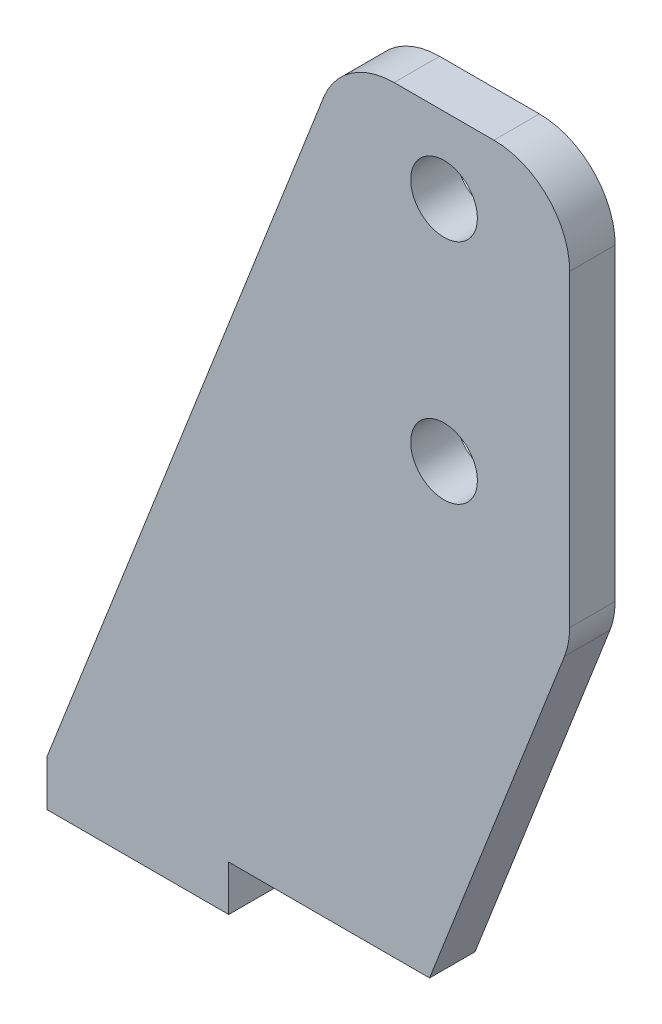
ISO-10303-21;
HEADER;
FILE_DESCRIPTION(('STEP AP214'),'2;1');
FILE_NAME('part.step','',(''),(''),'','','');
FILE_SCHEMA(('AUTOMOTIVE_DESIGN { 1 0 10303 214 1 1 1 1 }'));
ENDSEC;
DATA;
#1=APPLICATION_CONTEXT('core data for automotive mechanical design processes');
#2=APPLICATION_PROTOCOL_DEFINITION('international standard','automotive_design',2000,#1);
#3=PRODUCT_CONTEXT('',#1,'mechanical');
#4=PRODUCT('Part','Part','',(#3));
#5=PRODUCT_RELATED_PRODUCT_CATEGORY('part','',(#4));
#6=PRODUCT_DEFINITION_FORMATION('','',#4);
#7=PRODUCT_DEFINITION_CONTEXT('part definition',#1,'design');
#8=PRODUCT_DEFINITION('design','',#6,#7);
#9=PRODUCT_DEFINITION_SHAPE('','',#8);
#10=(LENGTH_UNIT() NAMED_UNIT(*) SI_UNIT(.MILLI.,.METRE.));
#11=(NAMED_UNIT(*) PLANE_ANGLE_UNIT() SI_UNIT($,.RADIAN.));
#12=(NAMED_UNIT(*) SI_UNIT($,.STERADIAN.) SOLID_ANGLE_UNIT());
#13=UNCERTAINTY_MEASURE_WITH_UNIT(LENGTH_MEASURE(1.E-05),#10,'distance_accuracy_value','');
#14=(GEOMETRIC_REPRESENTATION_CONTEXT(3) GLOBAL_UNCERTAINTY_ASSIGNED_CONTEXT((#13)) GLOBAL_UNIT_ASSIGNED_CONTEXT((#10,
#11,#12)) REPRESENTATION_CONTEXT('',''));
#15=CARTESIAN_POINT('',(0.,0.,0.));
#16=DIRECTION('',(0.,0.,1.));
#17=DIRECTION('',(1.,0.,0.));
#18=AXIS2_PLACEMENT_3D('',#15,#16,#17);
#19=CARTESIAN_POINT('',(0.,50.,3.));
#20=DIRECTION('',(0.,1.,0.));
#21=DIRECTION('',(-1.,0.,0.));
#22=AXIS2_PLACEMENT_3D('',#19,#20,#21);
#23=PLANE('',#22);
#24=DIRECTION('',(1.,0.,0.));
#25=VECTOR('',#24,1.);
#26=CARTESIAN_POINT('',(0.,50.,0.));
#27=LINE('',#26,#25);
#28=CARTESIAN_POINT('',(22.9167960646926,50.,0.));
#29=VERTEX_POINT('',#28);
#30=CARTESIAN_POINT('',(29.5,50.,0.));
#31=VERTEX_POINT('',#30);
#32=EDGE_CURVE('E154',#29,#31,#27,.T.);
#33=ORIENTED_EDGE('',*,*,#32,.F.);
#34=DIRECTION('',(0.,0.,-1.));
#35=VECTOR('',#34,1.);
#36=CARTESIAN_POINT('',(22.9167960646926,50.,3.));
#37=LINE('',#36,#35);
#38=CARTESIAN_POINT('',(22.9167960646926,50.,3.));
#39=VERTEX_POINT('',#38);
#40=EDGE_CURVE('E11',#39,#29,#37,.T.);
#41=ORIENTED_EDGE('',*,*,#40,.F.);
#42=DIRECTION('',(1.,0.,0.));
#43=VECTOR('',#42,1.);
#44=CARTESIAN_POINT('',(0.,50.,3.));
#45=LINE('',#44,#43);
#46=CARTESIAN_POINT('',(29.5,50.,3.));
#47=VERTEX_POINT('',#46);
#48=EDGE_CURVE('E222',#39,#47,#45,.T.);
#49=ORIENTED_EDGE('',*,*,#48,.T.);
#50=DIRECTION('',(0.,0.,-1.));
#51=VECTOR('',#50,1.);
#52=CARTESIAN_POINT('',(29.5,50.,3.));
#53=LINE('',#52,#51);
#54=EDGE_CURVE('E95',#47,#31,#53,.T.);
#55=ORIENTED_EDGE('',*,*,#54,.T.);
#56=EDGE_LOOP('',(#33,#41,#49,#55));
#57=FACE_BOUND('',#56,.T.);
#58=ADVANCED_FACE('F35',(#57),#23,.T.);
#59=CARTESIAN_POINT('',(22.9167960646926,45.,3.));
#60=DIRECTION('',(0.,0.,-1.));
#61=DIRECTION('',(-1.,0.,0.));
#62=AXIS2_PLACEMENT_3D('',#59,#60,#61);
#63=CYLINDRICAL_SURFACE('',#62,5.);
#64=CARTESIAN_POINT('',(22.9167960646926,45.,0.));
#65=DIRECTION('',(0.,0.,1.));
#66=DIRECTION('',(1.,0.,0.));
#67=AXIS2_PLACEMENT_3D('',#64,#65,#66);
#68=CIRCLE('',#67,5.);
#69=CARTESIAN_POINT('',(18.2585232891587,46.8167263824582,0.));
#70=VERTEX_POINT('',#69);
#71=EDGE_CURVE('E157',#29,#70,#68,.T.);
#72=ORIENTED_EDGE('',*,*,#71,.T.);
#73=DIRECTION('',(0.,0.,-1.));
#74=VECTOR('',#73,1.);
#75=CARTESIAN_POINT('',(18.2585232891587,46.8167263824582,3.));
#76=LINE('',#75,#74);
#77=CARTESIAN_POINT('',(18.2585232891587,46.8167263824582,3.));
#78=VERTEX_POINT('',#77);
#79=EDGE_CURVE('E44',#78,#70,#76,.T.);
#80=ORIENTED_EDGE('',*,*,#79,.F.);
#81=CARTESIAN_POINT('',(22.9167960646926,45.,3.));
#82=DIRECTION('',(0.,0.,1.));
#83=DIRECTION('',(1.,0.,0.));
#84=AXIS2_PLACEMENT_3D('',#81,#82,#83);
#85=CIRCLE('',#84,5.);
#86=EDGE_CURVE('E220',#39,#78,#85,.T.);
#87=ORIENTED_EDGE('',*,*,#86,.F.);
#88=ORIENTED_EDGE('',*,*,#40,.T.);
#89=EDGE_LOOP('',(#72,#80,#87,#88));
#90=FACE_BOUND('',#89,.T.);
#91=ADVANCED_FACE('F207',(#90),#63,.T.);
#92=CARTESIAN_POINT('',(0.,0.,3.));
#93=DIRECTION('',(-0.931654555106779,0.363345276491644,0.));
#94=DIRECTION('',(-0.363345276491644,-0.93165455510678,0.));
#95=AXIS2_PLACEMENT_3D('',#92,#93,#94);
#96=PLANE('',#95);
#97=DIRECTION('',(0.363345276491644,0.931654555106779,0.));
#98=VECTOR('',#97,1.);
#99=CARTESIAN_POINT('',(0.,0.,0.));
#100=LINE('',#99,#98);
#101=CARTESIAN_POINT('',(0.,0.,0.));
#102=VERTEX_POINT('',#101);
#103=EDGE_CURVE('E160',#102,#70,#100,.T.);
#104=ORIENTED_EDGE('',*,*,#103,.F.);
#105=DIRECTION('',(0.,0.,-1.));
#106=VECTOR('',#105,1.);
#107=CARTESIAN_POINT('',(0.,0.,3.));
#108=LINE('',#107,#106);
#109=CARTESIAN_POINT('',(0.,0.,3.));
#110=VERTEX_POINT('',#109);
#111=EDGE_CURVE('E197',#110,#102,#108,.T.);
#112=ORIENTED_EDGE('',*,*,#111,.F.);
#113=DIRECTION('',(0.363345276491644,0.931654555106779,0.));
#114=VECTOR('',#113,1.);
#115=CARTESIAN_POINT('',(0.,0.,3.));
#116=LINE('',#115,#114);
#117=EDGE_CURVE('E204',#110,#78,#116,.T.);
#118=ORIENTED_EDGE('',*,*,#117,.T.);
#119=ORIENTED_EDGE('',*,*,#79,.T.);
#120=EDGE_LOOP('',(#104,#112,#118,#119));
#121=FACE_BOUND('',#120,.T.);
#122=ADVANCED_FACE('F202',(#121),#96,.T.);
#123=CARTESIAN_POINT('',(0.,0.,3.));
#124=DIRECTION('',(1.,0.,0.));
#125=DIRECTION('',(0.,1.,0.));
#126=AXIS2_PLACEMENT_3D('',#123,#124,#125);
#127=PLANE('',#126);
#128=DIRECTION('',(0.,-1.,0.));
#129=VECTOR('',#128,1.);
#130=CARTESIAN_POINT('',(0.,0.,0.));
#131=LINE('',#130,#129);
#132=CARTESIAN_POINT('',(0.,-3.,0.));
#133=VERTEX_POINT('',#132);
#134=EDGE_CURVE('E163',#102,#133,#131,.T.);
#135=ORIENTED_EDGE('',*,*,#134,.T.);
#136=DIRECTION('',(0.,0.,-1.));
#137=VECTOR('',#136,1.);
#138=CARTESIAN_POINT('',(0.,-3.,3.));
#139=LINE('',#138,#137);
#140=CARTESIAN_POINT('',(0.,-3.,3.));
#141=VERTEX_POINT('',#140);
#142=EDGE_CURVE('E194',#141,#133,#139,.T.);
#143=ORIENTED_EDGE('',*,*,#142,.F.);
#144=DIRECTION('',(0.,-1.,0.));
#145=VECTOR('',#144,1.);
#146=CARTESIAN_POINT('',(0.,0.,3.));
#147=LINE('',#146,#145);
#148=EDGE_CURVE('E216',#110,#141,#147,.T.);
#149=ORIENTED_EDGE('',*,*,#148,.F.);
#150=ORIENTED_EDGE('',*,*,#111,.T.);
#151=EDGE_LOOP('',(#135,#143,#149,#150));
#152=FACE_BOUND('',#151,.T.);
#153=ADVANCED_FACE('F213',(#152),#127,.F.);
#154=CARTESIAN_POINT('',(0.,-3.,3.));
#155=DIRECTION('',(0.,1.,0.));
#156=DIRECTION('',(-1.,0.,0.));
#157=AXIS2_PLACEMENT_3D('',#154,#155,#156);
#158=PLANE('',#157);
#159=DIRECTION('',(1.,0.,0.));
#160=VECTOR('',#159,1.);
#161=CARTESIAN_POINT('',(0.,-3.,0.));
#162=LINE('',#161,#160);
#163=CARTESIAN_POINT('',(12.,-2.99999999999999,0.));
#164=VERTEX_POINT('',#163);
#165=EDGE_CURVE('E166',#133,#164,#162,.T.);
#166=ORIENTED_EDGE('',*,*,#165,.T.);
#167=DIRECTION('',(0.,0.,-1.));
#168=VECTOR('',#167,1.);
#169=CARTESIAN_POINT('',(12.,-2.99999999999999,3.));
#170=LINE('',#169,#168);
#171=CARTESIAN_POINT('',(12.,-2.99999999999999,3.));
#172=VERTEX_POINT('',#171);
#173=EDGE_CURVE('E191',#172,#164,#170,.T.);
#174=ORIENTED_EDGE('',*,*,#173,.F.);
#175=DIRECTION('',(1.,0.,0.));
#176=VECTOR('',#175,1.);
#177=CARTESIAN_POINT('',(0.,-3.,3.));
#178=LINE('',#177,#176);
#179=EDGE_CURVE('E218',#141,#172,#178,.T.);
#180=ORIENTED_EDGE('',*,*,#179,.F.);
#181=ORIENTED_EDGE('',*,*,#142,.T.);
#182=EDGE_LOOP('',(#166,#174,#180,#181));
#183=FACE_BOUND('',#182,.T.);
#184=ADVANCED_FACE('F272',(#183),#158,.F.);
#185=CARTESIAN_POINT('',(12.,0.,3.));
#186=DIRECTION('',(-1.,0.,0.));
#187=DIRECTION('',(0.,0.,1.));
#188=AXIS2_PLACEMENT_3D('',#185,#186,#187);
#189=PLANE('',#188);
#190=DIRECTION('',(0.,1.,0.));
#191=VECTOR('',#190,1.);
#192=CARTESIAN_POINT('',(12.,0.,0.));
#193=LINE('',#192,#191);
#194=CARTESIAN_POINT('',(12.,0.,0.));
#195=VERTEX_POINT('',#194);
#196=EDGE_CURVE('E169',#164,#195,#193,.T.);
#197=ORIENTED_EDGE('',*,*,#196,.T.);
#198=DIRECTION('',(0.,0.,-1.));
#199=VECTOR('',#198,1.);
#200=CARTESIAN_POINT('',(12.,0.,3.));
#201=LINE('',#200,#199);
#202=CARTESIAN_POINT('',(12.,0.,3.));
#203=VERTEX_POINT('',#202);
#204=EDGE_CURVE('E189',#203,#195,#201,.T.);
#205=ORIENTED_EDGE('',*,*,#204,.F.);
#206=DIRECTION('',(0.,1.,0.));
#207=VECTOR('',#206,1.);
#208=CARTESIAN_POINT('',(12.,0.,3.));
#209=LINE('',#208,#207);
#210=EDGE_CURVE('E227',#172,#203,#209,.T.);
#211=ORIENTED_EDGE('',*,*,#210,.F.);
#212=ORIENTED_EDGE('',*,*,#173,.T.);
#213=EDGE_LOOP('',(#197,#205,#211,#212));
#214=FACE_BOUND('',#213,.T.);
#215=ADVANCED_FACE('F275',(#214),#189,.F.);
#216=CARTESIAN_POINT('',(0.,0.,3.));
#217=DIRECTION('',(0.,-1.,0.));
#218=DIRECTION('',(1.,0.,0.));
#219=AXIS2_PLACEMENT_3D('',#216,#217,#218);
#220=PLANE('',#219);
#221=DIRECTION('',(-1.,0.,0.));
#222=VECTOR('',#221,1.);
#223=CARTESIAN_POINT('',(0.,0.,0.));
#224=LINE('',#223,#222);
#225=CARTESIAN_POINT('',(25.2541846633556,0.,0.));
#226=VERTEX_POINT('',#225);
#227=EDGE_CURVE('E172',#226,#195,#224,.T.);
#228=ORIENTED_EDGE('',*,*,#227,.F.);
#229=DIRECTION('',(0.,0.,-1.));
#230=VECTOR('',#229,1.);
#231=CARTESIAN_POINT('',(25.2541846633556,0.,3.));
#232=LINE('',#231,#230);
#233=CARTESIAN_POINT('',(25.2541846633556,0.,3.));
#234=VERTEX_POINT('',#233);
#235=EDGE_CURVE('E187',#234,#226,#232,.T.);
#236=ORIENTED_EDGE('',*,*,#235,.F.);
#237=DIRECTION('',(-1.,0.,0.));
#238=VECTOR('',#237,1.);
#239=CARTESIAN_POINT('',(0.,0.,3.));
#240=LINE('',#239,#238);
#241=EDGE_CURVE('E229',#234,#203,#240,.T.);
#242=ORIENTED_EDGE('',*,*,#241,.T.);
#243=ORIENTED_EDGE('',*,*,#204,.T.);
#244=EDGE_LOOP('',(#228,#236,#242,#243));
#245=FACE_BOUND('',#244,.T.);
#246=ADVANCED_FACE('F279',(#245),#220,.T.);
#247=CARTESIAN_POINT('',(21.9201325087715,-8.54885167842087,3.));
#248=DIRECTION('',(0.931654555106779,-0.363345276491644,0.));
#249=DIRECTION('',(0.363345276491644,0.93165455510678,0.));
#250=AXIS2_PLACEMENT_3D('',#247,#248,#249);
#251=PLANE('',#250);
#252=DIRECTION('',(-0.363345276491644,-0.93165455510678,0.));
#253=VECTOR('',#252,1.);
#254=CARTESIAN_POINT('',(21.9201325087715,-8.54885167842087,0.));
#255=LINE('',#254,#253);
#256=CARTESIAN_POINT('',(34.1582727755339,22.8309951594315,0.));
#257=VERTEX_POINT('',#256);
#258=EDGE_CURVE('E175',#257,#226,#255,.T.);
#259=ORIENTED_EDGE('',*,*,#258,.F.);
#260=DIRECTION('',(0.,0.,-1.));
#261=VECTOR('',#260,1.);
#262=CARTESIAN_POINT('',(34.1582727755339,22.8309951594315,3.));
#263=LINE('',#262,#261);
#264=CARTESIAN_POINT('',(34.1582727755339,22.8309951594315,3.));
#265=VERTEX_POINT('',#264);
#266=EDGE_CURVE('E141',#265,#257,#263,.T.);
#267=ORIENTED_EDGE('',*,*,#266,.F.);
#268=DIRECTION('',(-0.363345276491644,-0.93165455510678,0.));
#269=VECTOR('',#268,1.);
#270=CARTESIAN_POINT('',(21.9201325087715,-8.54885167842087,3.));
#271=LINE('',#270,#269);
#272=EDGE_CURVE('E130',#265,#234,#271,.T.);
#273=ORIENTED_EDGE('',*,*,#272,.T.);
#274=ORIENTED_EDGE('',*,*,#235,.T.);
#275=EDGE_LOOP('',(#259,#267,#273,#274));
#276=FACE_BOUND('',#275,.T.);
#277=ADVANCED_FACE('F233',(#276),#251,.T.);
#278=CARTESIAN_POINT('',(29.5,24.6477215418897,3.));
#279=DIRECTION('',(0.,0.,-1.));
#280=DIRECTION('',(-1.,0.,0.));
#281=AXIS2_PLACEMENT_3D('',#278,#279,#280);
#282=CYLINDRICAL_SURFACE('',#281,5.);
#283=CARTESIAN_POINT('',(29.5,24.6477215418897,0.));
#284=DIRECTION('',(0.,0.,1.));
#285=DIRECTION('',(1.,0.,0.));
#286=AXIS2_PLACEMENT_3D('',#283,#284,#285);
#287=CIRCLE('',#286,5.);
#288=CARTESIAN_POINT('',(34.5,24.6477215418897,0.));
#289=VERTEX_POINT('',#288);
#290=EDGE_CURVE('E137',#257,#289,#287,.T.);
#291=ORIENTED_EDGE('',*,*,#290,.T.);
#292=DIRECTION('',(0.,0.,-1.));
#293=VECTOR('',#292,1.);
#294=CARTESIAN_POINT('',(34.5,24.6477215418897,3.));
#295=LINE('',#294,#293);
#296=CARTESIAN_POINT('',(34.5,24.6477215418897,3.));
#297=VERTEX_POINT('',#296);
#298=EDGE_CURVE('E134',#297,#289,#295,.T.);
#299=ORIENTED_EDGE('',*,*,#298,.F.);
#300=CARTESIAN_POINT('',(29.5,24.6477215418897,3.));
#301=DIRECTION('',(0.,0.,1.));
#302=DIRECTION('',(1.,0.,0.));
#303=AXIS2_PLACEMENT_3D('',#300,#301,#302);
#304=CIRCLE('',#303,5.);
#305=EDGE_CURVE('E123',#265,#297,#304,.T.);
#306=ORIENTED_EDGE('',*,*,#305,.F.);
#307=ORIENTED_EDGE('',*,*,#266,.T.);
#308=EDGE_LOOP('',(#291,#299,#306,#307));
#309=FACE_BOUND('',#308,.T.);
#310=ADVANCED_FACE('F135',(#309),#282,.T.);
#311=CARTESIAN_POINT('',(34.5,0.,3.));
#312=DIRECTION('',(1.,0.,0.));
#313=DIRECTION('',(0.,1.,0.));
#314=AXIS2_PLACEMENT_3D('',#311,#312,#313);
#315=PLANE('',#314);
#316=DIRECTION('',(0.,-1.,0.));
#317=VECTOR('',#316,1.);
#318=CARTESIAN_POINT('',(34.5,0.,0.));
#319=LINE('',#318,#317);
#320=CARTESIAN_POINT('',(34.5,45.,0.));
#321=VERTEX_POINT('',#320);
#322=EDGE_CURVE('E179',#321,#289,#319,.T.);
#323=ORIENTED_EDGE('',*,*,#322,.F.);
#324=DIRECTION('',(0.,0.,-1.));
#325=VECTOR('',#324,1.);
#326=CARTESIAN_POINT('',(34.5,45.,3.));
#327=LINE('',#326,#325);
#328=CARTESIAN_POINT('',(34.5,45.,3.));
#329=VERTEX_POINT('',#328);
#330=EDGE_CURVE('E88',#329,#321,#327,.T.);
#331=ORIENTED_EDGE('',*,*,#330,.F.);
#332=DIRECTION('',(0.,-1.,0.));
#333=VECTOR('',#332,1.);
#334=CARTESIAN_POINT('',(34.5,0.,3.));
#335=LINE('',#334,#333);
#336=EDGE_CURVE('E127',#329,#297,#335,.T.);
#337=ORIENTED_EDGE('',*,*,#336,.T.);
#338=ORIENTED_EDGE('',*,*,#298,.T.);
#339=EDGE_LOOP('',(#323,#331,#337,#338));
#340=FACE_BOUND('',#339,.T.);
#341=ADVANCED_FACE('F143',(#340),#315,.T.);
#342=CARTESIAN_POINT('',(26.2083980323463,30.,3.));
#343=DIRECTION('',(0.,0.,-1.));
#344=DIRECTION('',(-1.,0.,0.));
#345=AXIS2_PLACEMENT_3D('',#342,#343,#344);
#346=CYLINDRICAL_SURFACE('',#345,2.2);
#347=CARTESIAN_POINT('',(26.2083980323463,30.,3.));
#348=DIRECTION('',(0.,0.,1.));
#349=DIRECTION('',(1.,0.,0.));
#350=AXIS2_PLACEMENT_3D('',#347,#348,#349);
#351=CIRCLE('',#350,2.2);
#352=CARTESIAN_POINT('',(28.4083980323463,30.,3.));
#353=VERTEX_POINT('',#352);
#354=EDGE_CURVE('E236',#353,#353,#351,.T.);
#355=ORIENTED_EDGE('',*,*,#354,.T.);
#356=EDGE_LOOP('',(#355));
#357=FACE_BOUND('',#356,.T.);
#358=CARTESIAN_POINT('',(26.2083980323463,30.,0.));
#359=DIRECTION('',(0.,0.,1.));
#360=DIRECTION('',(1.,0.,0.));
#361=AXIS2_PLACEMENT_3D('',#358,#359,#360);
#362=CIRCLE('',#361,2.2);
#363=CARTESIAN_POINT('',(28.4083980323463,30.,0.));
#364=VERTEX_POINT('',#363);
#365=EDGE_CURVE('E151',#364,#364,#362,.T.);
#366=ORIENTED_EDGE('',*,*,#365,.F.);
#367=EDGE_LOOP('',(#366));
#368=FACE_BOUND('',#367,.T.);
#369=ADVANCED_FACE('F250',(#357,#368),#346,.F.);
#370=CARTESIAN_POINT('',(26.2083980323463,45.,3.));
#371=DIRECTION('',(0.,0.,-1.));
#372=DIRECTION('',(-1.,0.,0.));
#373=AXIS2_PLACEMENT_3D('',#370,#371,#372);
#374=CYLINDRICAL_SURFACE('',#373,2.2);
#375=CARTESIAN_POINT('',(26.2083980323463,45.,3.));
#376=DIRECTION('',(0.,0.,1.));
#377=DIRECTION('',(1.,0.,0.));
#378=AXIS2_PLACEMENT_3D('',#375,#376,#377);
#379=CIRCLE('',#378,2.2);
#380=CARTESIAN_POINT('',(28.4083980323463,45.,3.));
#381=VERTEX_POINT('',#380);
#382=EDGE_CURVE('E183',#381,#381,#379,.T.);
#383=ORIENTED_EDGE('',*,*,#382,.T.);
#384=EDGE_LOOP('',(#383));
#385=FACE_BOUND('',#384,.T.);
#386=CARTESIAN_POINT('',(26.2083980323463,45.,0.));
#387=DIRECTION('',(0.,0.,1.));
#388=DIRECTION('',(1.,0.,0.));
#389=AXIS2_PLACEMENT_3D('',#386,#387,#388);
#390=CIRCLE('',#389,2.2);
#391=CARTESIAN_POINT('',(28.4083980323463,45.,0.));
#392=VERTEX_POINT('',#391);
#393=EDGE_CURVE('E148',#392,#392,#390,.T.);
#394=ORIENTED_EDGE('',*,*,#393,.F.);
#395=EDGE_LOOP('',(#394));
#396=FACE_BOUND('',#395,.T.);
#397=ADVANCED_FACE('F37',(#385,#396),#374,.F.);
#398=CARTESIAN_POINT('',(29.5,45.,3.));
#399=DIRECTION('',(0.,0.,-1.));
#400=DIRECTION('',(-1.,0.,0.));
#401=AXIS2_PLACEMENT_3D('',#398,#399,#400);
#402=CYLINDRICAL_SURFACE('',#401,5.);
#403=CARTESIAN_POINT('',(29.5,45.,0.));
#404=DIRECTION('',(0.,0.,1.));
#405=DIRECTION('',(1.,0.,0.));
#406=AXIS2_PLACEMENT_3D('',#403,#404,#405);
#407=CIRCLE('',#406,5.);
#408=EDGE_CURVE('E181',#321,#31,#407,.T.);
#409=ORIENTED_EDGE('',*,*,#408,.T.);
#410=ORIENTED_EDGE('',*,*,#54,.F.);
#411=CARTESIAN_POINT('',(29.5,45.,3.));
#412=DIRECTION('',(0.,0.,1.));
#413=DIRECTION('',(1.,0.,0.));
#414=AXIS2_PLACEMENT_3D('',#411,#412,#413);
#415=CIRCLE('',#414,5.);
#416=EDGE_CURVE('E52',#329,#47,#415,.T.);
#417=ORIENTED_EDGE('',*,*,#416,.F.);
#418=ORIENTED_EDGE('',*,*,#330,.T.);
#419=EDGE_LOOP('',(#409,#410,#417,#418));
#420=FACE_BOUND('',#419,.T.);
#421=ADVANCED_FACE('F235',(#420),#402,.T.);
#422=CARTESIAN_POINT('',(0.,0.,3.));
#423=DIRECTION('',(0.,0.,1.));
#424=DIRECTION('',(1.,0.,0.));
#425=AXIS2_PLACEMENT_3D('',#422,#423,#424);
#426=PLANE('',#425);
#427=ORIENTED_EDGE('',*,*,#382,.F.);
#428=EDGE_LOOP('',(#427));
#429=FACE_BOUND('',#428,.T.);
#430=ORIENTED_EDGE('',*,*,#354,.F.);
#431=EDGE_LOOP('',(#430));
#432=FACE_BOUND('',#431,.T.);
#433=ORIENTED_EDGE('',*,*,#48,.F.);
#434=ORIENTED_EDGE('',*,*,#86,.T.);
#435=ORIENTED_EDGE('',*,*,#117,.F.);
#436=ORIENTED_EDGE('',*,*,#148,.T.);
#437=ORIENTED_EDGE('',*,*,#179,.T.);
#438=ORIENTED_EDGE('',*,*,#210,.T.);
#439=ORIENTED_EDGE('',*,*,#241,.F.);
#440=ORIENTED_EDGE('',*,*,#272,.F.);
#441=ORIENTED_EDGE('',*,*,#305,.T.);
#442=ORIENTED_EDGE('',*,*,#336,.F.);
#443=ORIENTED_EDGE('',*,*,#416,.T.);
#444=EDGE_LOOP('',(#433,#434,#435,#436,#437,#438,#439,#440,#441,#442,#443));
#445=FACE_BOUND('',#444,.T.);
#446=ADVANCED_FACE('F125',(#429,#432,#445),#426,.T.);
#447=CARTESIAN_POINT('',(0.,0.,0.));
#448=DIRECTION('',(0.,0.,1.));
#449=DIRECTION('',(1.,0.,0.));
#450=AXIS2_PLACEMENT_3D('',#447,#448,#449);
#451=PLANE('',#450);
#452=ORIENTED_EDGE('',*,*,#393,.T.);
#453=EDGE_LOOP('',(#452));
#454=FACE_BOUND('',#453,.T.);
#455=ORIENTED_EDGE('',*,*,#365,.T.);
#456=EDGE_LOOP('',(#455));
#457=FACE_BOUND('',#456,.T.);
#458=ORIENTED_EDGE('',*,*,#32,.T.);
#459=ORIENTED_EDGE('',*,*,#408,.F.);
#460=ORIENTED_EDGE('',*,*,#322,.T.);
#461=ORIENTED_EDGE('',*,*,#290,.F.);
#462=ORIENTED_EDGE('',*,*,#258,.T.);
#463=ORIENTED_EDGE('',*,*,#227,.T.);
#464=ORIENTED_EDGE('',*,*,#196,.F.);
#465=ORIENTED_EDGE('',*,*,#165,.F.);
#466=ORIENTED_EDGE('',*,*,#134,.F.);
#467=ORIENTED_EDGE('',*,*,#103,.T.);
#468=ORIENTED_EDGE('',*,*,#71,.F.);
#469=EDGE_LOOP('',(#458,#459,#460,#461,#462,#463,#464,#465,#466,#467,#468));
#470=FACE_BOUND('',#469,.T.);
#471=ADVANCED_FACE('F210',(#454,#457,#470),#451,.F.);
#472=CLOSED_SHELL('',(#58,#91,#122,#153,#184,#215,#246,#277,#310,#341,#369,#397,#421,#446,#471));
#473=MANIFOLD_SOLID_BREP('B2',#472);
#474=ADVANCED_BREP_SHAPE_REPRESENTATION('',(#18,#473),#14);
#475=SHAPE_DEFINITION_REPRESENTATION(#9,#474);
ENDSEC;
END-ISO-10303-21;
